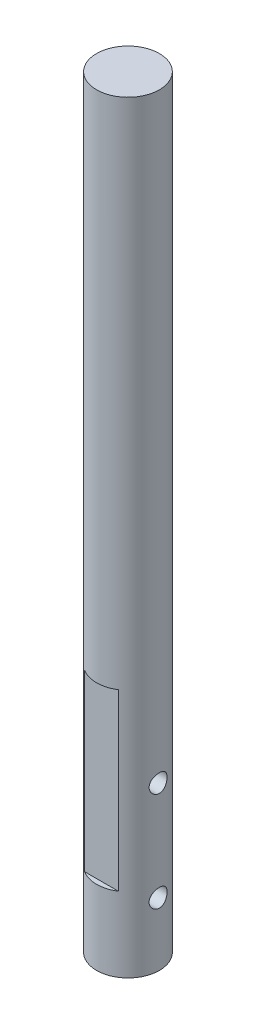
ISO-10303-21;
HEADER;
FILE_DESCRIPTION(('STEP AP214'),'2;1');
FILE_NAME('part.step','',(''),(''),'','','');
FILE_SCHEMA(('AUTOMOTIVE_DESIGN { 1 0 10303 214 1 1 1 1 }'));
ENDSEC;
DATA;
#1=APPLICATION_CONTEXT('core data for automotive mechanical design processes');
#2=APPLICATION_PROTOCOL_DEFINITION('international standard','automotive_design',2000,#1);
#3=PRODUCT_CONTEXT('',#1,'mechanical');
#4=PRODUCT('Part','Part','',(#3));
#5=PRODUCT_RELATED_PRODUCT_CATEGORY('part','',(#4));
#6=PRODUCT_DEFINITION_FORMATION('','',#4);
#7=PRODUCT_DEFINITION_CONTEXT('part definition',#1,'design');
#8=PRODUCT_DEFINITION('design','',#6,#7);
#9=PRODUCT_DEFINITION_SHAPE('','',#8);
#10=(LENGTH_UNIT() NAMED_UNIT(*) SI_UNIT(.MILLI.,.METRE.));
#11=(NAMED_UNIT(*) PLANE_ANGLE_UNIT() SI_UNIT($,.RADIAN.));
#12=(NAMED_UNIT(*) SI_UNIT($,.STERADIAN.) SOLID_ANGLE_UNIT());
#13=UNCERTAINTY_MEASURE_WITH_UNIT(LENGTH_MEASURE(1.E-05),#10,'distance_accuracy_value','');
#14=(GEOMETRIC_REPRESENTATION_CONTEXT(3) GLOBAL_UNCERTAINTY_ASSIGNED_CONTEXT((#13)) GLOBAL_UNIT_ASSIGNED_CONTEXT((#10,
#11,#12)) REPRESENTATION_CONTEXT('',''));
#15=CARTESIAN_POINT('',(0.,0.,0.));
#16=DIRECTION('',(0.,0.,1.));
#17=DIRECTION('',(1.,0.,0.));
#18=AXIS2_PLACEMENT_3D('',#15,#16,#17);
#19=CARTESIAN_POINT('',(1.70809069196037,75.,2.56354148831794));
#20=DIRECTION('',(0.,-1.,0.));
#21=DIRECTION('',(0.,0.,-1.));
#22=AXIS2_PLACEMENT_3D('',#19,#20,#21);
#23=CYLINDRICAL_SURFACE('',#22,3.5);
#24=CARTESIAN_POINT('',(-1.64601127428931,8.09218802218847,1.56354148831794));
#25=CARTESIAN_POINT('',(-1.64601204333783,8.14711379111122,1.56354247808333));
#26=CARTESIAN_POINT('',(-1.64737520741197,8.20204956426823,1.56808215530855));
#27=CARTESIAN_POINT('',(-1.65266125505877,8.31032364157602,1.5860796713558));
#28=CARTESIAN_POINT('',(-1.65658517978584,8.36366128673003,1.59954113763464));
#29=CARTESIAN_POINT('',(-1.66651285538464,8.46715662263967,1.63489477185753));
#30=CARTESIAN_POINT('',(-1.67251338425601,8.51731909810118,1.65677388505962));
#31=CARTESIAN_POINT('',(-1.68591391359082,8.6132719279615,1.7082996680022));
#32=CARTESIAN_POINT('',(-1.6933140801847,8.65906176237636,1.73794725998593));
#33=CARTESIAN_POINT('',(-1.70891822409079,8.74628380484704,1.80507908782724));
#34=CARTESIAN_POINT('',(-1.71713808785512,8.78757192325339,1.84274688275177));
#35=CARTESIAN_POINT('',(-1.73331913560497,8.86333941384005,1.92445586558323));
#36=CARTESIAN_POINT('',(-1.74128028920931,8.8978179887498,1.96849779873811));
#37=CARTESIAN_POINT('',(-1.75622596804574,8.95960234636531,2.06271847223917));
#38=CARTESIAN_POINT('',(-1.76318958054357,8.98676283206398,2.11299609643702));
#39=CARTESIAN_POINT('',(-1.77517201046767,9.03218890939643,2.21763725069812));
#40=CARTESIAN_POINT('',(-1.78019120649406,9.05045623280859,2.27199998288036));
#41=CARTESIAN_POINT('',(-1.7876069045407,9.07710525280833,2.38176220075736));
#42=CARTESIAN_POINT('',(-1.79006844309612,9.0857325330408,2.43709758925342));
#43=CARTESIAN_POINT('',(-1.79231978633812,9.09363138913008,2.54848143710698));
#44=CARTESIAN_POINT('',(-1.79211010173454,9.09290475335715,2.60452975811222));
#45=CARTESIAN_POINT('',(-1.78908934185616,9.08228483472946,2.71403158618555));
#46=CARTESIAN_POINT('',(-1.7863536619199,9.07265721586948,2.76751326137242));
#47=CARTESIAN_POINT('',(-1.77867873969029,9.04494047095628,2.87206759940675));
#48=CARTESIAN_POINT('',(-1.77373936332068,9.02685083005741,2.9231401154682));
#49=CARTESIAN_POINT('',(-1.76210446690025,8.98253332178256,3.02207840518241));
#50=CARTESIAN_POINT('',(-1.75539033560056,8.9562186332843,3.06990301024333));
#51=CARTESIAN_POINT('',(-1.74092315290957,8.89626572898946,3.16054511011319));
#52=CARTESIAN_POINT('',(-1.7331698739984,8.86262590835524,3.20336150452595));
#53=CARTESIAN_POINT('',(-1.71713772313876,8.78758516687916,3.28435781259182));
#54=CARTESIAN_POINT('',(-1.70884995489042,8.74595330538591,3.3223222771104));
#55=CARTESIAN_POINT('',(-1.69292417697073,8.65683047626552,3.39078799619282));
#56=CARTESIAN_POINT('',(-1.68528622005204,8.60933903371408,3.42128864520923));
#57=CARTESIAN_POINT('',(-1.67148518212621,8.50932257993936,3.4741581682452));
#58=CARTESIAN_POINT('',(-1.66533436278729,8.4567604096622,3.49646017726187));
#59=CARTESIAN_POINT('',(-1.6553520299219,8.34841144043659,3.53183624579833));
#60=CARTESIAN_POINT('',(-1.65151984160415,8.29262558486013,3.54491299033124));
#61=CARTESIAN_POINT('',(-1.64675488421711,8.18144781002658,3.56107857431677));
#62=CARTESIAN_POINT('',(-1.6457278653441,8.12610711372803,3.5644922291049));
#63=CARTESIAN_POINT('',(-1.64643010674192,8.015643864231,3.5621364719164));
#64=CARTESIAN_POINT('',(-1.64815902319304,7.96052128468116,3.55636820544043));
#65=CARTESIAN_POINT('',(-1.65408645812234,7.85336740817319,3.53610039544724));
#66=CARTESIAN_POINT('',(-1.65822752281703,7.80129422917987,3.52180379923855));
#67=CARTESIAN_POINT('',(-1.66845462774314,7.70028708619062,3.48511729765019));
#68=CARTESIAN_POINT('',(-1.67454094860884,7.65135357636592,3.46272622445181));
#69=CARTESIAN_POINT('',(-1.68816024807273,7.55667698457981,3.40985131392604));
#70=CARTESIAN_POINT('',(-1.69572529494152,7.51104280008729,3.3791809469636));
#71=CARTESIAN_POINT('',(-1.7113779407925,7.42544983546686,3.31084380674216));
#72=CARTESIAN_POINT('',(-1.71946565277869,7.38549228868242,3.27317551715863));
#73=CARTESIAN_POINT('',(-1.73558294521901,7.31099831304435,3.19039549330072));
#74=CARTESIAN_POINT('',(-1.74360133827006,7.27669053647909,3.14507534343822));
#75=CARTESIAN_POINT('',(-1.7583991932699,7.21616518149711,3.04913414184672));
#76=CARTESIAN_POINT('',(-1.76517871996676,7.18994718022728,2.99851336736704));
#77=CARTESIAN_POINT('',(-1.77669183227158,7.1465958786753,2.89375812479603));
#78=CARTESIAN_POINT('',(-1.78144084867584,7.12939382739539,2.83965388826776));
#79=CARTESIAN_POINT('',(-1.78842600615907,7.10437462121838,2.72916431259291));
#80=CARTESIAN_POINT('',(-1.79066279365472,7.09655505209781,2.67277956411066));
#81=CARTESIAN_POINT('',(-1.79233598305604,7.09069230518957,2.56145236933843));
#82=CARTESIAN_POINT('',(-1.7918678259846,7.09231594764706,2.50652867279297));
#83=CARTESIAN_POINT('',(-1.7884046536503,7.10450716289361,2.39776890210694));
#84=CARTESIAN_POINT('',(-1.78540975939258,7.11507430737948,2.34393277600918));
#85=CARTESIAN_POINT('',(-1.77725331734021,7.14465370267789,2.23933942179815));
#86=CARTESIAN_POINT('',(-1.77211137828052,7.16358961166045,2.18855897160042));
#87=CARTESIAN_POINT('',(-1.76019477875686,7.20930110133121,2.09086788693721));
#88=CARTESIAN_POINT('',(-1.75341986554845,7.23607789573459,2.04395785302761));
#89=CARTESIAN_POINT('',(-1.73870408524066,7.29763669090087,1.95382476014099));
#90=CARTESIAN_POINT('',(-1.73073453697115,7.33263306558266,1.91075282431441));
#91=CARTESIAN_POINT('',(-1.7146296329719,7.40924258491545,1.83098087715876));
#92=CARTESIAN_POINT('',(-1.70649423197382,7.45085755773093,1.79428263222306));
#93=CARTESIAN_POINT('',(-1.69072949576039,7.54083648068615,1.7273372581723));
#94=CARTESIAN_POINT('',(-1.68311906688744,7.58934899594003,1.69728490469992));
#95=CARTESIAN_POINT('',(-1.66955153469246,7.69094895484596,1.6458017702199));
#96=CARTESIAN_POINT('',(-1.66359350661877,7.74403381773329,1.62436616389386));
#97=CARTESIAN_POINT('',(-1.65470160583996,7.84601487230422,1.59304881825542));
#98=CARTESIAN_POINT('',(-1.65147150227042,7.89453319623772,1.58201198840868));
#99=CARTESIAN_POINT('',(-1.64712615531141,7.99276108136643,1.56725845310011));
#100=CARTESIAN_POINT('',(-1.64601057816392,8.04247045331147,1.56354059240461));
#101=CARTESIAN_POINT('',(-1.64601127428931,8.09218802218847,1.56354148831794));
#102=B_SPLINE_CURVE_WITH_KNOTS('',3,(#24,#25,#26,#27,#28,#29,#30,#31,#32,#33,#34,#35,#36,#37,
#38,#39,#40,#41,#42,#43,#44,#45,#46,#47,#48,#49,#50,#51,#52,#53,#54,#55,#56,#57,#58,#59,#60,#61,
#62,#63,#64,#65,#66,#67,#68,#69,#70,#71,#72,#73,#74,#75,#76,#77,#78,#79,#80,#81,#82,#83,#84,#85,
#86,#87,#88,#89,#90,#91,#92,#93,#94,#95,#96,#97,#98,#99,#100,#101),.UNSPECIFIED.,.T.,.F.,(4,2,2,
2,2,2,2,2,2,2,2,2,2,2,2,2,2,2,2,2,2,2,2,2,2,2,2,2,2,2,2,2,2,2,2,2,2,2,4),(0.,0.164594171159102,
0.32925530476515,0.493662091823938,0.658088405459393,0.826785835988802,0.995503006148134,
1.16735741502495,1.33917834504425,1.50651450509943,1.67381867271781,1.83628518817283,
1.99876158968833,2.16301451684818,2.3273034658799,2.49735806342072,2.66742645310452,
2.83885260310575,3.01022883892078,3.17577181660546,3.34129414341279,3.50302644820309,
3.66478209600074,3.83054003013245,3.99633392302106,4.16772694180382,4.33911100034378,
4.50916842641099,4.67918208530373,4.84323448834084,5.00727903537341,5.16985706186659,
5.33246026763666,5.4998988436474,5.66738374949711,5.83926806202707,6.0110559859988,
6.16006644425301,6.30905338065555),.UNSPECIFIED.);
#103=CARTESIAN_POINT('',(-1.64601127428931,8.09218802218847,1.56354148831794));
#104=VERTEX_POINT('',#103);
#105=EDGE_CURVE('E35',#104,#104,#102,.T.);
#106=ORIENTED_EDGE('',*,*,#105,.T.);
#107=EDGE_LOOP('',(#106));
#108=FACE_BOUND('',#107,.T.);
#109=CARTESIAN_POINT('',(5.06219265821006,8.09218802218847,1.56354148831794));
#110=CARTESIAN_POINT('',(5.06219342725857,8.03726225326571,1.56354247808333));
#111=CARTESIAN_POINT('',(5.06355659133271,7.9823264801087,1.56808215530855));
#112=CARTESIAN_POINT('',(5.06884263897952,7.87405240280091,1.5860796713558));
#113=CARTESIAN_POINT('',(5.07276656370659,7.8207147576469,1.59954113763464));
#114=CARTESIAN_POINT('',(5.08269423930539,7.71721942173726,1.63489477185753));
#115=CARTESIAN_POINT('',(5.08869476817676,7.66705694627575,1.65677388505963));
#116=CARTESIAN_POINT('',(5.10209529751157,7.57110411641543,1.7082996680022));
#117=CARTESIAN_POINT('',(5.10949546410545,7.52531428200057,1.73794725998593));
#118=CARTESIAN_POINT('',(5.12509960801154,7.43809223952989,1.80507908782724));
#119=CARTESIAN_POINT('',(5.13331947177587,7.39680412112355,1.84274688275178));
#120=CARTESIAN_POINT('',(5.14950051952572,7.32103663053688,1.92445586558323));
#121=CARTESIAN_POINT('',(5.15746167313006,7.28655805562713,1.96849779873811));
#122=CARTESIAN_POINT('',(5.17240735196649,7.22477369801162,2.06271847223917));
#123=CARTESIAN_POINT('',(5.17937096446432,7.19761321231295,2.11299609643702));
#124=CARTESIAN_POINT('',(5.19135339438842,7.1521871349805,2.21763725069812));
#125=CARTESIAN_POINT('',(5.1963725904148,7.13391981156834,2.27199998288036));
#126=CARTESIAN_POINT('',(5.20378828846145,7.1072707915686,2.38176220075736));
#127=CARTESIAN_POINT('',(5.20624982701686,7.09864351133613,2.43709758925343));
#128=CARTESIAN_POINT('',(5.20850117025887,7.09074465524685,2.54848143710698));
#129=CARTESIAN_POINT('',(5.20829148565529,7.09147129101979,2.60452975811222));
#130=CARTESIAN_POINT('',(5.20527072577691,7.10209120964748,2.71403158618556));
#131=CARTESIAN_POINT('',(5.20253504584064,7.11171882850746,2.76751326137242));
#132=CARTESIAN_POINT('',(5.19486012361104,7.13943557342065,2.87206759940675));
#133=CARTESIAN_POINT('',(5.18992074724143,7.15752521431953,2.9231401154682));
#134=CARTESIAN_POINT('',(5.178285850821,7.20184272259438,3.02207840518241));
#135=CARTESIAN_POINT('',(5.1715717195213,7.22815741109263,3.06990301024333));
#136=CARTESIAN_POINT('',(5.15710453683031,7.28811031538747,3.16054511011319));
#137=CARTESIAN_POINT('',(5.14935125791914,7.3217501360217,3.20336150452595));
#138=CARTESIAN_POINT('',(5.1333191070595,7.39679087749777,3.28435781259182));
#139=CARTESIAN_POINT('',(5.12503133881117,7.43842273899102,3.3223222771104));
#140=CARTESIAN_POINT('',(5.10910556089147,7.52754556811141,3.39078799619282));
#141=CARTESIAN_POINT('',(5.10146760397278,7.57503701066285,3.42128864520923));
#142=CARTESIAN_POINT('',(5.08766656604695,7.67505346443758,3.4741581682452));
#143=CARTESIAN_POINT('',(5.08151574670804,7.72761563471473,3.49646017726187));
#144=CARTESIAN_POINT('',(5.07153341384264,7.83596460394034,3.53183624579833));
#145=CARTESIAN_POINT('',(5.0677012255249,7.89175045951681,3.54491299033124));
#146=CARTESIAN_POINT('',(5.06293626813786,8.00292823435036,3.56107857431677));
#147=CARTESIAN_POINT('',(5.06190924926485,8.0582689306489,3.5644922291049));
#148=CARTESIAN_POINT('',(5.06261149066266,8.16873218014593,3.5621364719164));
#149=CARTESIAN_POINT('',(5.06434040711379,8.22385475969577,3.55636820544043));
#150=CARTESIAN_POINT('',(5.07026784204309,8.33100863620375,3.53610039544724));
#151=CARTESIAN_POINT('',(5.07440890673777,8.38308181519707,3.52180379923855));
#152=CARTESIAN_POINT('',(5.08463601166389,8.48408895818631,3.48511729765019));
#153=CARTESIAN_POINT('',(5.09072233252959,8.53302246801101,3.46272622445181));
#154=CARTESIAN_POINT('',(5.10434163199347,8.62769905979712,3.40985131392604));
#155=CARTESIAN_POINT('',(5.11190667886227,8.67333324428964,3.3791809469636));
#156=CARTESIAN_POINT('',(5.12755932471325,8.75892620891007,3.31084380674216));
#157=CARTESIAN_POINT('',(5.13564703669944,8.79888375569452,3.27317551715863));
#158=CARTESIAN_POINT('',(5.15176432913976,8.87337773133258,3.19039549330072));
#159=CARTESIAN_POINT('',(5.15978272219081,8.90768550789784,3.14507534343822));
#160=CARTESIAN_POINT('',(5.17458057719065,8.96821086287983,3.04913414184672));
#161=CARTESIAN_POINT('',(5.18136010388751,8.99442886414966,2.99851336736704));
#162=CARTESIAN_POINT('',(5.19287321619233,9.03778016570164,2.89375812479603));
#163=CARTESIAN_POINT('',(5.19762223259659,9.05498221698155,2.83965388826776));
#164=CARTESIAN_POINT('',(5.20460739007982,9.08000142315856,2.72916431259291));
#165=CARTESIAN_POINT('',(5.20684417757547,9.08782099227913,2.67277956411066));
#166=CARTESIAN_POINT('',(5.20851736697679,9.09368373918736,2.56145236933843));
#167=CARTESIAN_POINT('',(5.20804920990535,9.09206009672988,2.50652867279297));
#168=CARTESIAN_POINT('',(5.20458603757105,9.07986888148332,2.39776890210694));
#169=CARTESIAN_POINT('',(5.20159114331333,9.06930173699745,2.34393277600918));
#170=CARTESIAN_POINT('',(5.19343470126096,9.03972234169904,2.23933942179815));
#171=CARTESIAN_POINT('',(5.18829276220127,9.02078643271648,2.18855897160042));
#172=CARTESIAN_POINT('',(5.17637616267761,8.97507494304573,2.09086788693721));
#173=CARTESIAN_POINT('',(5.1696012494692,8.94829814864234,2.0439578530276));
#174=CARTESIAN_POINT('',(5.15488546916141,8.88673935347606,1.95382476014099));
#175=CARTESIAN_POINT('',(5.14691592089189,8.85174297879428,1.9107528243144));
#176=CARTESIAN_POINT('',(5.13081101689265,8.77513345946148,1.83098087715875));
#177=CARTESIAN_POINT('',(5.12267561589457,8.733518486646,1.79428263222306));
#178=CARTESIAN_POINT('',(5.10691087968114,8.64353956369078,1.7273372581723));
#179=CARTESIAN_POINT('',(5.09930045080819,8.5950270484369,1.69728490469992));
#180=CARTESIAN_POINT('',(5.08573291861321,8.49342708953097,1.6458017702199));
#181=CARTESIAN_POINT('',(5.07977489053952,8.44034222664364,1.62436616389385));
#182=CARTESIAN_POINT('',(5.07088298976071,8.33836117207271,1.59304881825542));
#183=CARTESIAN_POINT('',(5.06765288619117,8.28984284813921,1.58201198840868));
#184=CARTESIAN_POINT('',(5.06330753923215,8.1916149630105,1.56725845310011));
#185=CARTESIAN_POINT('',(5.06219196208466,8.14190559106546,1.56354059240461));
#186=CARTESIAN_POINT('',(5.06219265821006,8.09218802218847,1.56354148831794));
#187=B_SPLINE_CURVE_WITH_KNOTS('',3,(#109,#110,#111,#112,#113,#114,#115,#116,#117,#118,#119,
#120,#121,#122,#123,#124,#125,#126,#127,#128,#129,#130,#131,#132,#133,#134,#135,#136,#137,#138,
#139,#140,#141,#142,#143,#144,#145,#146,#147,#148,#149,#150,#151,#152,#153,#154,#155,#156,#157,
#158,#159,#160,#161,#162,#163,#164,#165,#166,#167,#168,#169,#170,#171,#172,#173,#174,#175,#176,
#177,#178,#179,#180,#181,#182,#183,#184,#185,#186),.UNSPECIFIED.,.T.,.F.,(4,2,2,2,2,2,2,2,2,2,2,
2,2,2,2,2,2,2,2,2,2,2,2,2,2,2,2,2,2,2,2,2,2,2,2,2,2,2,4),(0.,0.164594171159105,
0.329255304765151,0.49366209182394,0.658088405459395,0.826785835988803,0.995503006148135,
1.16735741502495,1.33917834504425,1.50651450509943,1.67381867271781,1.83628518817283,
1.99876158968833,2.16301451684818,2.3273034658799,2.49735806342072,2.66742645310452,
2.83885260310575,3.01022883892078,3.17577181660546,3.34129414341279,3.5030264482031,
3.66478209600074,3.83054003013245,3.99633392302107,4.16772694180383,4.33911100034378,
4.50916842641099,4.67918208530374,4.84323448834085,5.00727903537342,5.1698570618666,
5.33246026763666,5.49989884364741,5.66738374949712,5.83926806202708,6.0110559859988,
6.16006644425301,6.30905338065555),.UNSPECIFIED.);
#188=CARTESIAN_POINT('',(5.06219265821006,8.09218802218847,1.56354148831794));
#189=VERTEX_POINT('',#188);
#190=EDGE_CURVE('E148',#189,#189,#187,.T.);
#191=ORIENTED_EDGE('',*,*,#190,.T.);
#192=EDGE_LOOP('',(#191));
#193=FACE_BOUND('',#192,.T.);
#194=CARTESIAN_POINT('',(-1.64601127428931,-2.98010571335672,1.56354148831794));
#195=CARTESIAN_POINT('',(-1.64601204333783,-2.92517994443396,1.56354247808333));
#196=CARTESIAN_POINT('',(-1.64737520741197,-2.87024417127695,1.56808215530855));
#197=CARTESIAN_POINT('',(-1.65266125505878,-2.76197009396916,1.5860796713558));
#198=CARTESIAN_POINT('',(-1.65658517978584,-2.70863244881515,1.59954113763465));
#199=CARTESIAN_POINT('',(-1.66651285538464,-2.60513711290551,1.63489477185754));
#200=CARTESIAN_POINT('',(-1.67251338425602,-2.554974637444,1.65677388505963));
#201=CARTESIAN_POINT('',(-1.68591391359082,-2.45902180758368,1.7082996680022));
#202=CARTESIAN_POINT('',(-1.6933140801847,-2.41323197316882,1.73794725998593));
#203=CARTESIAN_POINT('',(-1.7089182240908,-2.32600993069815,1.80507908782724));
#204=CARTESIAN_POINT('',(-1.71713808785512,-2.2847218122918,1.84274688275178));
#205=CARTESIAN_POINT('',(-1.73331913560497,-2.20895432170513,1.92445586558323));
#206=CARTESIAN_POINT('',(-1.74128028920931,-2.17447574679538,1.96849779873811));
#207=CARTESIAN_POINT('',(-1.75622596804574,-2.11269138917987,2.06271847223917));
#208=CARTESIAN_POINT('',(-1.76318958054357,-2.0855309034812,2.11299609643702));
#209=CARTESIAN_POINT('',(-1.77517201046767,-2.04010482614875,2.21763725069812));
#210=CARTESIAN_POINT('',(-1.78019120649406,-2.02183750273659,2.27199998288036));
#211=CARTESIAN_POINT('',(-1.7876069045407,-1.99518848273685,2.38176220075736));
#212=CARTESIAN_POINT('',(-1.79006844309612,-1.98656120250438,2.43709758925343));
#213=CARTESIAN_POINT('',(-1.79231978633812,-1.9786623464151,2.54848143710698));
#214=CARTESIAN_POINT('',(-1.79211010173454,-1.97938898218804,2.60452975811222));
#215=CARTESIAN_POINT('',(-1.78908934185616,-1.99000890081573,2.71403158618555));
#216=CARTESIAN_POINT('',(-1.7863536619199,-1.99963651967571,2.76751326137242));
#217=CARTESIAN_POINT('',(-1.77867873969029,-2.0273532645889,2.87206759940675));
#218=CARTESIAN_POINT('',(-1.77373936332068,-2.04544290548778,2.9231401154682));
#219=CARTESIAN_POINT('',(-1.76210446690025,-2.08976041376263,3.02207840518241));
#220=CARTESIAN_POINT('',(-1.75539033560056,-2.11607510226088,3.06990301024333));
#221=CARTESIAN_POINT('',(-1.74092315290957,-2.17602800655572,3.16054511011319));
#222=CARTESIAN_POINT('',(-1.7331698739984,-2.20966782718995,3.20336150452595));
#223=CARTESIAN_POINT('',(-1.71713772313876,-2.28470856866602,3.28435781259182));
#224=CARTESIAN_POINT('',(-1.70884995489042,-2.32634043015927,3.3223222771104));
#225=CARTESIAN_POINT('',(-1.69292417697073,-2.41546325927966,3.39078799619282));
#226=CARTESIAN_POINT('',(-1.68528622005204,-2.4629547018311,3.42128864520923));
#227=CARTESIAN_POINT('',(-1.67148518212621,-2.56297115560583,3.4741581682452));
#228=CARTESIAN_POINT('',(-1.66533436278729,-2.61553332588298,3.49646017726187));
#229=CARTESIAN_POINT('',(-1.6553520299219,-2.72388229510859,3.53183624579833));
#230=CARTESIAN_POINT('',(-1.65151984160415,-2.77966815068506,3.54491299033124));
#231=CARTESIAN_POINT('',(-1.64675488421711,-2.89084592551861,3.56107857431677));
#232=CARTESIAN_POINT('',(-1.6457278653441,-2.94618662181715,3.5644922291049));
#233=CARTESIAN_POINT('',(-1.64643010674192,-3.05664987131418,3.5621364719164));
#234=CARTESIAN_POINT('',(-1.64815902319304,-3.11177245086402,3.55636820544043));
#235=CARTESIAN_POINT('',(-1.65408645812234,-3.218926327372,3.53610039544723));
#236=CARTESIAN_POINT('',(-1.65822752281703,-3.27099950636532,3.52180379923855));
#237=CARTESIAN_POINT('',(-1.66845462774314,-3.37200664935456,3.48511729765019));
#238=CARTESIAN_POINT('',(-1.67454094860884,-3.42094015917926,3.46272622445181));
#239=CARTESIAN_POINT('',(-1.68816024807273,-3.51561675096537,3.40985131392604));
#240=CARTESIAN_POINT('',(-1.69572529494152,-3.56125093545789,3.37918094696359));
#241=CARTESIAN_POINT('',(-1.7113779407925,-3.64684390007832,3.31084380674216));
#242=CARTESIAN_POINT('',(-1.71946565277869,-3.68680144686276,3.27317551715863));
#243=CARTESIAN_POINT('',(-1.73558294521901,-3.76129542250083,3.19039549330072));
#244=CARTESIAN_POINT('',(-1.74360133827006,-3.79560319906609,3.14507534343822));
#245=CARTESIAN_POINT('',(-1.7583991932699,-3.85612855404808,3.04913414184672));
#246=CARTESIAN_POINT('',(-1.76517871996676,-3.8823465553179,2.99851336736704));
#247=CARTESIAN_POINT('',(-1.77669183227158,-3.92569785686988,2.89375812479603));
#248=CARTESIAN_POINT('',(-1.78144084867584,-3.9428999081498,2.83965388826776));
#249=CARTESIAN_POINT('',(-1.78842600615907,-3.96791911432681,2.72916431259291));
#250=CARTESIAN_POINT('',(-1.79066279365472,-3.97573868344737,2.67277956411066));
#251=CARTESIAN_POINT('',(-1.79233598305604,-3.98160143035561,2.56145236933843));
#252=CARTESIAN_POINT('',(-1.7918678259846,-3.97997778789813,2.50652867279297));
#253=CARTESIAN_POINT('',(-1.7884046536503,-3.96778657265157,2.39776890210694));
#254=CARTESIAN_POINT('',(-1.78540975939258,-3.9572194281657,2.34393277600918));
#255=CARTESIAN_POINT('',(-1.77725331734021,-3.92764003286729,2.23933942179815));
#256=CARTESIAN_POINT('',(-1.77211137828052,-3.90870412388473,2.18855897160042));
#257=CARTESIAN_POINT('',(-1.76019477875686,-3.86299263421397,2.09086788693721));
#258=CARTESIAN_POINT('',(-1.75341986554845,-3.83621583981059,2.04395785302761));
#259=CARTESIAN_POINT('',(-1.73870408524066,-3.77465704464431,1.95382476014099));
#260=CARTESIAN_POINT('',(-1.73073453697115,-3.73966066996252,1.91075282431441));
#261=CARTESIAN_POINT('',(-1.7146296329719,-3.66305115062973,1.83098087715876));
#262=CARTESIAN_POINT('',(-1.70649423197382,-3.62143617781425,1.79428263222306));
#263=CARTESIAN_POINT('',(-1.69072949576039,-3.53145725485903,1.7273372581723));
#264=CARTESIAN_POINT('',(-1.68311906688744,-3.48294473960515,1.69728490469992));
#265=CARTESIAN_POINT('',(-1.66955153469246,-3.38134478069922,1.64580177021991));
#266=CARTESIAN_POINT('',(-1.66359350661877,-3.32825991781189,1.62436616389386));
#267=CARTESIAN_POINT('',(-1.65470160583996,-3.22627886324096,1.59304881825542));
#268=CARTESIAN_POINT('',(-1.65147150227042,-3.17776053930746,1.58201198840868));
#269=CARTESIAN_POINT('',(-1.64712615531141,-3.07953265417875,1.56725845310012));
#270=CARTESIAN_POINT('',(-1.64601057816392,-3.02982328223371,1.56354059240461));
#271=CARTESIAN_POINT('',(-1.64601127428931,-2.98010571335672,1.56354148831794));
#272=B_SPLINE_CURVE_WITH_KNOTS('',3,(#194,#195,#196,#197,#198,#199,#200,#201,#202,#203,#204,
#205,#206,#207,#208,#209,#210,#211,#212,#213,#214,#215,#216,#217,#218,#219,#220,#221,#222,#223,
#224,#225,#226,#227,#228,#229,#230,#231,#232,#233,#234,#235,#236,#237,#238,#239,#240,#241,#242,
#243,#244,#245,#246,#247,#248,#249,#250,#251,#252,#253,#254,#255,#256,#257,#258,#259,#260,#261,
#262,#263,#264,#265,#266,#267,#268,#269,#270,#271),.UNSPECIFIED.,.T.,.F.,(4,2,2,2,2,2,2,2,2,2,2,
2,2,2,2,2,2,2,2,2,2,2,2,2,2,2,2,2,2,2,2,2,2,2,2,2,2,2,4),(0.,0.164594171159104,0.32925530476515,
0.493662091823938,0.658088405459393,0.826785835988801,0.995503006148133,1.16735741502495,
1.33917834504425,1.50651450509943,1.67381867271781,1.83628518817283,1.99876158968833,
2.16301451684817,2.32730346587989,2.49735806342072,2.66742645310452,2.83885260310575,
3.01022883892078,3.17577181660546,3.34129414341278,3.50302644820309,3.66478209600074,
3.83054003013244,3.99633392302106,4.16772694180382,4.33911100034377,4.50916842641098,
4.67918208530373,4.84323448834084,5.00727903537341,5.16985706186659,5.33246026763665,
5.4998988436474,5.66738374949711,5.83926806202707,6.01105598599879,6.160066444253,
6.30905338065554),.UNSPECIFIED.);
#273=CARTESIAN_POINT('',(-1.64601127428931,-2.98010571335672,1.56354148831794));
#274=VERTEX_POINT('',#273);
#275=EDGE_CURVE('E88',#274,#274,#272,.T.);
#276=ORIENTED_EDGE('',*,*,#275,.T.);
#277=EDGE_LOOP('',(#276));
#278=FACE_BOUND('',#277,.T.);
#279=CARTESIAN_POINT('',(5.06219265821006,-2.98010571335672,1.56354148831794));
#280=CARTESIAN_POINT('',(5.06219342725857,-3.03503148227947,1.56354247808333));
#281=CARTESIAN_POINT('',(5.06355659133271,-3.08996725543648,1.56808215530855));
#282=CARTESIAN_POINT('',(5.06884263897952,-3.19824133274427,1.5860796713558));
#283=CARTESIAN_POINT('',(5.07276656370659,-3.25157897789828,1.59954113763465));
#284=CARTESIAN_POINT('',(5.08269423930539,-3.35507431380792,1.63489477185754));
#285=CARTESIAN_POINT('',(5.08869476817676,-3.40523678926943,1.65677388505963));
#286=CARTESIAN_POINT('',(5.10209529751157,-3.50118961912975,1.7082996680022));
#287=CARTESIAN_POINT('',(5.10949546410545,-3.54697945354461,1.73794725998593));
#288=CARTESIAN_POINT('',(5.12509960801154,-3.63420149601529,1.80507908782724));
#289=CARTESIAN_POINT('',(5.13331947177587,-3.67548961442163,1.84274688275178));
#290=CARTESIAN_POINT('',(5.14950051952572,-3.7512571050083,1.92445586558323));
#291=CARTESIAN_POINT('',(5.15746167313006,-3.78573567991805,1.96849779873811));
#292=CARTESIAN_POINT('',(5.17240735196649,-3.84752003753356,2.06271847223917));
#293=CARTESIAN_POINT('',(5.17937096446432,-3.87468052323223,2.11299609643702));
#294=CARTESIAN_POINT('',(5.19135339438842,-3.92010660056468,2.21763725069812));
#295=CARTESIAN_POINT('',(5.1963725904148,-3.93837392397684,2.27199998288036));
#296=CARTESIAN_POINT('',(5.20378828846145,-3.96502294397658,2.38176220075736));
#297=CARTESIAN_POINT('',(5.20624982701686,-3.97365022420905,2.43709758925343));
#298=CARTESIAN_POINT('',(5.20850117025887,-3.98154908029833,2.54848143710698));
#299=CARTESIAN_POINT('',(5.20829148565529,-3.98082244452539,2.60452975811222));
#300=CARTESIAN_POINT('',(5.20527072577691,-3.9702025258977,2.71403158618556));
#301=CARTESIAN_POINT('',(5.20253504584064,-3.96057490703772,2.76751326137242));
#302=CARTESIAN_POINT('',(5.19486012361104,-3.93285816212453,2.87206759940675));
#303=CARTESIAN_POINT('',(5.18992074724143,-3.91476852122566,2.9231401154682));
#304=CARTESIAN_POINT('',(5.178285850821,-3.87045101295081,3.02207840518241));
#305=CARTESIAN_POINT('',(5.1715717195213,-3.84413632445255,3.06990301024333));
#306=CARTESIAN_POINT('',(5.15710453683031,-3.78418342015771,3.16054511011319));
#307=CARTESIAN_POINT('',(5.14935125791914,-3.75054359952349,3.20336150452595));
#308=CARTESIAN_POINT('',(5.1333191070595,-3.67550285804741,3.28435781259182));
#309=CARTESIAN_POINT('',(5.12503133881117,-3.63387099655416,3.3223222771104));
#310=CARTESIAN_POINT('',(5.10910556089147,-3.54474816743377,3.39078799619282));
#311=CARTESIAN_POINT('',(5.10146760397278,-3.49725672488233,3.42128864520923));
#312=CARTESIAN_POINT('',(5.08766656604695,-3.39724027110761,3.4741581682452));
#313=CARTESIAN_POINT('',(5.08151574670804,-3.34467810083045,3.49646017726187));
#314=CARTESIAN_POINT('',(5.07153341384264,-3.23632913160484,3.53183624579833));
#315=CARTESIAN_POINT('',(5.0677012255249,-3.18054327602838,3.54491299033124));
#316=CARTESIAN_POINT('',(5.06293626813786,-3.06936550119483,3.56107857431677));
#317=CARTESIAN_POINT('',(5.06190924926485,-3.01402480489628,3.5644922291049));
#318=CARTESIAN_POINT('',(5.06261149066266,-2.90356155539925,3.5621364719164));
#319=CARTESIAN_POINT('',(5.06434040711379,-2.84843897584941,3.55636820544043));
#320=CARTESIAN_POINT('',(5.07026784204309,-2.74128509934143,3.53610039544723));
#321=CARTESIAN_POINT('',(5.07440890673777,-2.68921192034812,3.52180379923855));
#322=CARTESIAN_POINT('',(5.08463601166389,-2.58820477735887,3.48511729765019));
#323=CARTESIAN_POINT('',(5.09072233252959,-2.53927126753417,3.46272622445181));
#324=CARTESIAN_POINT('',(5.10434163199347,-2.44459467574806,3.40985131392604));
#325=CARTESIAN_POINT('',(5.11190667886227,-2.39896049125554,3.37918094696359));
#326=CARTESIAN_POINT('',(5.12755932471325,-2.31336752663511,3.31084380674216));
#327=CARTESIAN_POINT('',(5.13564703669944,-2.27340997985067,3.27317551715863));
#328=CARTESIAN_POINT('',(5.15176432913976,-2.1989160042126,3.19039549330072));
#329=CARTESIAN_POINT('',(5.15978272219081,-2.16460822764734,3.14507534343822));
#330=CARTESIAN_POINT('',(5.17458057719065,-2.10408287266536,3.04913414184672));
#331=CARTESIAN_POINT('',(5.18136010388751,-2.07786487139553,2.99851336736704));
#332=CARTESIAN_POINT('',(5.19287321619233,-2.03451356984355,2.89375812479603));
#333=CARTESIAN_POINT('',(5.19762223259659,-2.01731151856364,2.83965388826776));
#334=CARTESIAN_POINT('',(5.20460739007982,-1.99229231238663,2.72916431259291));
#335=CARTESIAN_POINT('',(5.20684417757547,-1.98447274326606,2.67277956411066));
#336=CARTESIAN_POINT('',(5.20851736697679,-1.97860999635782,2.56145236933843));
#337=CARTESIAN_POINT('',(5.20804920990535,-1.98023363881531,2.50652867279297));
#338=CARTESIAN_POINT('',(5.20458603757105,-1.99242485406186,2.39776890210694));
#339=CARTESIAN_POINT('',(5.20159114331333,-2.00299199854774,2.34393277600918));
#340=CARTESIAN_POINT('',(5.19343470126096,-2.03257139384614,2.23933942179815));
#341=CARTESIAN_POINT('',(5.18829276220127,-2.0515073028287,2.18855897160042));
#342=CARTESIAN_POINT('',(5.17637616267761,-2.09721879249946,2.09086788693721));
#343=CARTESIAN_POINT('',(5.1696012494692,-2.12399558690284,2.04395785302761));
#344=CARTESIAN_POINT('',(5.15488546916141,-2.18555438206912,1.95382476014099));
#345=CARTESIAN_POINT('',(5.14691592089189,-2.22055075675091,1.91075282431441));
#346=CARTESIAN_POINT('',(5.13081101689265,-2.2971602760837,1.83098087715876));
#347=CARTESIAN_POINT('',(5.12267561589457,-2.33877524889918,1.79428263222306));
#348=CARTESIAN_POINT('',(5.10691087968114,-2.4287541718544,1.7273372581723));
#349=CARTESIAN_POINT('',(5.09930045080819,-2.47726668710828,1.69728490469992));
#350=CARTESIAN_POINT('',(5.08573291861321,-2.57886664601421,1.64580177021991));
#351=CARTESIAN_POINT('',(5.07977489053952,-2.63195150890154,1.62436616389386));
#352=CARTESIAN_POINT('',(5.07088298976071,-2.73393256347247,1.59304881825542));
#353=CARTESIAN_POINT('',(5.06765288619117,-2.78245088740597,1.58201198840868));
#354=CARTESIAN_POINT('',(5.06330753923215,-2.88067877253468,1.56725845310012));
#355=CARTESIAN_POINT('',(5.06219196208466,-2.93038814447972,1.56354059240461));
#356=CARTESIAN_POINT('',(5.06219265821006,-2.98010571335672,1.56354148831794));
#357=B_SPLINE_CURVE_WITH_KNOTS('',3,(#279,#280,#281,#282,#283,#284,#285,#286,#287,#288,#289,
#290,#291,#292,#293,#294,#295,#296,#297,#298,#299,#300,#301,#302,#303,#304,#305,#306,#307,#308,
#309,#310,#311,#312,#313,#314,#315,#316,#317,#318,#319,#320,#321,#322,#323,#324,#325,#326,#327,
#328,#329,#330,#331,#332,#333,#334,#335,#336,#337,#338,#339,#340,#341,#342,#343,#344,#345,#346,
#347,#348,#349,#350,#351,#352,#353,#354,#355,#356),.UNSPECIFIED.,.T.,.F.,(4,2,2,2,2,2,2,2,2,2,2,
2,2,2,2,2,2,2,2,2,2,2,2,2,2,2,2,2,2,2,2,2,2,2,2,2,2,2,4),(0.,0.164594171159105,0.32925530476515,
0.493662091823938,0.658088405459393,0.826785835988801,0.995503006148134,1.16735741502495,
1.33917834504425,1.50651450509943,1.67381867271781,1.83628518817283,1.99876158968833,
2.16301451684818,2.32730346587989,2.49735806342072,2.66742645310452,2.83885260310575,
3.01022883892078,3.17577181660546,3.34129414341278,3.50302644820309,3.66478209600074,
3.83054003013244,3.99633392302106,4.16772694180382,4.33911100034377,4.50916842641098,
4.67918208530373,4.84323448834084,5.00727903537341,5.16985706186659,5.33246026763665,
5.4998988436474,5.66738374949711,5.83926806202707,6.01105598599879,6.16006644425301,
6.30905338065555),.UNSPECIFIED.);
#358=CARTESIAN_POINT('',(5.06219265821006,-2.98010571335672,1.56354148831794));
#359=VERTEX_POINT('',#358);
#360=EDGE_CURVE('E94',#359,#359,#357,.T.);
#361=ORIENTED_EDGE('',*,*,#360,.T.);
#362=EDGE_LOOP('',(#361));
#363=FACE_BOUND('',#362,.T.);
#364=DIRECTION('',(0.,-1.,0.));
#365=VECTOR('',#364,1.);
#366=CARTESIAN_POINT('',(-0.174066776240535,75.,5.51438598860859));
#367=LINE('',#366,#365);
#368=CARTESIAN_POINT('',(-0.174066776240535,-1.68025833460218,5.51438598860859));
#369=VERTEX_POINT('',#368);
#370=CARTESIAN_POINT('',(-0.174066776240536,17.7674069232836,5.51438598860859));
#371=VERTEX_POINT('',#370);
#372=EDGE_CURVE('E80',#369,#371,#367,.F.);
#373=ORIENTED_EDGE('',*,*,#372,.T.);
#374=CARTESIAN_POINT('',(1.70809069196037,17.7674069232836,2.56354148831794));
#375=DIRECTION('',(0.,1.,0.));
#376=DIRECTION('',(0.,0.,1.));
#377=AXIS2_PLACEMENT_3D('',#374,#375,#376);
#378=CIRCLE('',#377,3.5);
#379=CARTESIAN_POINT('',(3.59024816016128,17.7674069232836,5.51438598860859));
#380=VERTEX_POINT('',#379);
#381=EDGE_CURVE('E11',#371,#380,#378,.T.);
#382=ORIENTED_EDGE('',*,*,#381,.T.);
#383=DIRECTION('',(0.,-1.,0.));
#384=VECTOR('',#383,1.);
#385=CARTESIAN_POINT('',(3.59024816016128,75.,5.51438598860859));
#386=LINE('',#385,#384);
#387=CARTESIAN_POINT('',(3.59024816016128,-1.68025833460218,5.51438598860859));
#388=VERTEX_POINT('',#387);
#389=EDGE_CURVE('E43',#380,#388,#386,.T.);
#390=ORIENTED_EDGE('',*,*,#389,.T.);
#391=CARTESIAN_POINT('',(1.70809069196037,-1.68025833460218,2.56354148831794));
#392=DIRECTION('',(0.,-1.,0.));
#393=DIRECTION('',(0.,0.,-1.));
#394=AXIS2_PLACEMENT_3D('',#391,#392,#393);
#395=CIRCLE('',#394,3.5);
#396=EDGE_CURVE('E75',#388,#369,#395,.T.);
#397=ORIENTED_EDGE('',*,*,#396,.T.);
#398=EDGE_LOOP('',(#373,#382,#390,#397));
#399=FACE_BOUND('',#398,.T.);
#400=DIRECTION('',(0.,-1.,0.));
#401=VECTOR('',#400,1.);
#402=CARTESIAN_POINT('',(-0.174066776240538,75.,-0.387303011972699));
#403=LINE('',#402,#401);
#404=CARTESIAN_POINT('',(-0.174066776240538,17.7674069232836,-0.387303011972699));
#405=VERTEX_POINT('',#404);
#406=CARTESIAN_POINT('',(-0.174066776240538,-1.68025833460218,-0.387303011972699));
#407=VERTEX_POINT('',#406);
#408=EDGE_CURVE('E239',#405,#407,#403,.T.);
#409=ORIENTED_EDGE('',*,*,#408,.T.);
#410=CARTESIAN_POINT('',(1.70809069196037,-1.68025833460218,2.56354148831794));
#411=DIRECTION('',(0.,-1.,0.));
#412=DIRECTION('',(0.,0.,-1.));
#413=AXIS2_PLACEMENT_3D('',#410,#411,#412);
#414=CIRCLE('',#413,3.5);
#415=CARTESIAN_POINT('',(3.59024816016128,-1.68025833460218,-0.387303011972699));
#416=VERTEX_POINT('',#415);
#417=EDGE_CURVE('E81',#407,#416,#414,.T.);
#418=ORIENTED_EDGE('',*,*,#417,.T.);
#419=DIRECTION('',(0.,-1.,0.));
#420=VECTOR('',#419,1.);
#421=CARTESIAN_POINT('',(3.59024816016128,75.,-0.387303011972699));
#422=LINE('',#421,#420);
#423=CARTESIAN_POINT('',(3.59024816016128,17.7674069232836,-0.387303011972699));
#424=VERTEX_POINT('',#423);
#425=EDGE_CURVE('E236',#416,#424,#422,.F.);
#426=ORIENTED_EDGE('',*,*,#425,.T.);
#427=CARTESIAN_POINT('',(1.70809069196037,17.7674069232836,2.56354148831794));
#428=DIRECTION('',(0.,1.,0.));
#429=DIRECTION('',(0.,0.,1.));
#430=AXIS2_PLACEMENT_3D('',#427,#428,#429);
#431=CIRCLE('',#430,3.5);
#432=EDGE_CURVE('E228',#424,#405,#431,.T.);
#433=ORIENTED_EDGE('',*,*,#432,.T.);
#434=EDGE_LOOP('',(#409,#418,#426,#433));
#435=FACE_BOUND('',#434,.T.);
#436=CARTESIAN_POINT('',(1.70809069196037,75.,2.56354148831794));
#437=DIRECTION('',(0.,1.,0.));
#438=DIRECTION('',(0.,0.,1.));
#439=AXIS2_PLACEMENT_3D('',#436,#437,#438);
#440=CIRCLE('',#439,3.5);
#441=CARTESIAN_POINT('',(1.70809069196037,75.,6.06354148831794));
#442=VERTEX_POINT('',#441);
#443=EDGE_CURVE('E224',#442,#442,#440,.T.);
#444=ORIENTED_EDGE('',*,*,#443,.F.);
#445=EDGE_LOOP('',(#444));
#446=FACE_BOUND('',#445,.T.);
#447=CARTESIAN_POINT('',(1.70809069196037,-10.,2.56354148831794));
#448=DIRECTION('',(0.,1.,0.));
#449=DIRECTION('',(0.,0.,1.));
#450=AXIS2_PLACEMENT_3D('',#447,#448,#449);
#451=CIRCLE('',#450,3.5);
#452=CARTESIAN_POINT('',(1.70809069196037,-10.,6.06354148831794));
#453=VERTEX_POINT('',#452);
#454=EDGE_CURVE('E222',#453,#453,#451,.T.);
#455=ORIENTED_EDGE('',*,*,#454,.T.);
#456=EDGE_LOOP('',(#455));
#457=FACE_BOUND('',#456,.T.);
#458=ADVANCED_FACE('F31',(#108,#193,#278,#363,#399,#435,#446,#457),#23,.T.);
#459=CARTESIAN_POINT('',(1.70809069196037,75.,2.56354148831794));
#460=DIRECTION('',(0.,1.,0.));
#461=DIRECTION('',(0.,0.,1.));
#462=AXIS2_PLACEMENT_3D('',#459,#460,#461);
#463=PLANE('',#462);
#464=ORIENTED_EDGE('',*,*,#443,.T.);
#465=EDGE_LOOP('',(#464));
#466=FACE_BOUND('',#465,.T.);
#467=ADVANCED_FACE('F130',(#466),#463,.T.);
#468=CARTESIAN_POINT('',(1.70809069196037,-10.,2.56354148831794));
#469=DIRECTION('',(0.,1.,0.));
#470=DIRECTION('',(0.,0.,1.));
#471=AXIS2_PLACEMENT_3D('',#468,#469,#470);
#472=PLANE('',#471);
#473=ORIENTED_EDGE('',*,*,#454,.F.);
#474=EDGE_LOOP('',(#473));
#475=FACE_BOUND('',#474,.T.);
#476=ADVANCED_FACE('F123',(#475),#472,.F.);
#477=CARTESIAN_POINT('',(-9.,-1.68025833460218,-4.74586026763256));
#478=DIRECTION('',(0.,-1.,0.));
#479=DIRECTION('',(0.,0.,-1.));
#480=AXIS2_PLACEMENT_3D('',#477,#478,#479);
#481=PLANE('',#480);
#482=DIRECTION('',(1.,0.,0.));
#483=VECTOR('',#482,1.);
#484=CARTESIAN_POINT('',(-9.,-1.68025833460218,-0.387303011972699));
#485=LINE('',#484,#483);
#486=EDGE_CURVE('E225',#407,#416,#485,.T.);
#487=ORIENTED_EDGE('',*,*,#486,.T.);
#488=ORIENTED_EDGE('',*,*,#417,.F.);
#489=EDGE_LOOP('',(#487,#488));
#490=FACE_BOUND('',#489,.T.);
#491=ADVANCED_FACE('F119',(#490),#481,.F.);
#492=CARTESIAN_POINT('',(-9.,17.7674069232836,-0.387303011972699));
#493=DIRECTION('',(0.,0.,1.));
#494=DIRECTION('',(1.,0.,0.));
#495=AXIS2_PLACEMENT_3D('',#492,#493,#494);
#496=PLANE('',#495);
#497=DIRECTION('',(1.,0.,0.));
#498=VECTOR('',#497,1.);
#499=CARTESIAN_POINT('',(-9.,17.7674069232836,-0.387303011972699));
#500=LINE('',#499,#498);
#501=EDGE_CURVE('E57',#405,#424,#500,.T.);
#502=ORIENTED_EDGE('',*,*,#501,.T.);
#503=ORIENTED_EDGE('',*,*,#425,.F.);
#504=ORIENTED_EDGE('',*,*,#486,.F.);
#505=ORIENTED_EDGE('',*,*,#408,.F.);
#506=EDGE_LOOP('',(#502,#503,#504,#505));
#507=FACE_BOUND('',#506,.T.);
#508=ADVANCED_FACE('F122',(#507),#496,.F.);
#509=CARTESIAN_POINT('',(-9.,17.7674069232836,-4.74586026763256));
#510=DIRECTION('',(0.,1.,0.));
#511=DIRECTION('',(0.,0.,1.));
#512=AXIS2_PLACEMENT_3D('',#509,#510,#511);
#513=PLANE('',#512);
#514=ORIENTED_EDGE('',*,*,#501,.F.);
#515=ORIENTED_EDGE('',*,*,#432,.F.);
#516=EDGE_LOOP('',(#514,#515));
#517=FACE_BOUND('',#516,.T.);
#518=ADVANCED_FACE('F117',(#517),#513,.F.);
#519=CARTESIAN_POINT('',(-9.,17.7674069232836,9.87294324426845));
#520=DIRECTION('',(0.,1.,0.));
#521=DIRECTION('',(0.,0.,1.));
#522=AXIS2_PLACEMENT_3D('',#519,#520,#521);
#523=PLANE('',#522);
#524=DIRECTION('',(1.,0.,0.));
#525=VECTOR('',#524,1.);
#526=CARTESIAN_POINT('',(-9.,17.7674069232836,5.51438598860859));
#527=LINE('',#526,#525);
#528=EDGE_CURVE('E87',#371,#380,#527,.T.);
#529=ORIENTED_EDGE('',*,*,#528,.T.);
#530=ORIENTED_EDGE('',*,*,#381,.F.);
#531=EDGE_LOOP('',(#529,#530));
#532=FACE_BOUND('',#531,.T.);
#533=ADVANCED_FACE('F112',(#532),#523,.F.);
#534=CARTESIAN_POINT('',(-9.,17.7674069232836,5.51438598860859));
#535=DIRECTION('',(0.,0.,-1.));
#536=DIRECTION('',(-1.,0.,0.));
#537=AXIS2_PLACEMENT_3D('',#534,#535,#536);
#538=PLANE('',#537);
#539=ORIENTED_EDGE('',*,*,#528,.F.);
#540=ORIENTED_EDGE('',*,*,#372,.F.);
#541=DIRECTION('',(1.,0.,0.));
#542=VECTOR('',#541,1.);
#543=CARTESIAN_POINT('',(-9.,-1.68025833460218,5.51438598860859));
#544=LINE('',#543,#542);
#545=EDGE_CURVE('E50',#369,#388,#544,.T.);
#546=ORIENTED_EDGE('',*,*,#545,.T.);
#547=ORIENTED_EDGE('',*,*,#389,.F.);
#548=EDGE_LOOP('',(#539,#540,#546,#547));
#549=FACE_BOUND('',#548,.T.);
#550=ADVANCED_FACE('F85',(#549),#538,.F.);
#551=CARTESIAN_POINT('',(-9.,-1.68025833460218,9.87294324426845));
#552=DIRECTION('',(0.,-1.,0.));
#553=DIRECTION('',(0.,0.,-1.));
#554=AXIS2_PLACEMENT_3D('',#551,#552,#553);
#555=PLANE('',#554);
#556=ORIENTED_EDGE('',*,*,#545,.F.);
#557=ORIENTED_EDGE('',*,*,#396,.F.);
#558=EDGE_LOOP('',(#556,#557));
#559=FACE_BOUND('',#558,.T.);
#560=ADVANCED_FACE('F76',(#559),#555,.F.);
#561=CARTESIAN_POINT('',(-9.,-2.98010571335672,2.56354148831795));
#562=DIRECTION('',(1.,0.,0.));
#563=DIRECTION('',(0.,0.,-1.));
#564=AXIS2_PLACEMENT_3D('',#561,#562,#563);
#565=CYLINDRICAL_SURFACE('',#564,1.);
#566=ORIENTED_EDGE('',*,*,#360,.F.);
#567=EDGE_LOOP('',(#566));
#568=FACE_BOUND('',#567,.T.);
#569=ORIENTED_EDGE('',*,*,#275,.F.);
#570=EDGE_LOOP('',(#569));
#571=FACE_BOUND('',#570,.T.);
#572=ADVANCED_FACE('F102',(#568,#571),#565,.F.);
#573=CARTESIAN_POINT('',(-9.,8.09218802218847,2.56354148831795));
#574=DIRECTION('',(1.,0.,0.));
#575=DIRECTION('',(0.,0.,-1.));
#576=AXIS2_PLACEMENT_3D('',#573,#574,#575);
#577=CYLINDRICAL_SURFACE('',#576,1.);
#578=ORIENTED_EDGE('',*,*,#190,.F.);
#579=EDGE_LOOP('',(#578));
#580=FACE_BOUND('',#579,.T.);
#581=ORIENTED_EDGE('',*,*,#105,.F.);
#582=EDGE_LOOP('',(#581));
#583=FACE_BOUND('',#582,.T.);
#584=ADVANCED_FACE('F106',(#580,#583),#577,.F.);
#585=CLOSED_SHELL('',(#458,#467,#476,#491,#508,#518,#533,#550,#560,#572,#584));
#586=MANIFOLD_SOLID_BREP('B2',#585);
#587=ADVANCED_BREP_SHAPE_REPRESENTATION('',(#18,#586),#14);
#588=SHAPE_DEFINITION_REPRESENTATION(#9,#587);
ENDSEC;
END-ISO-10303-21;
